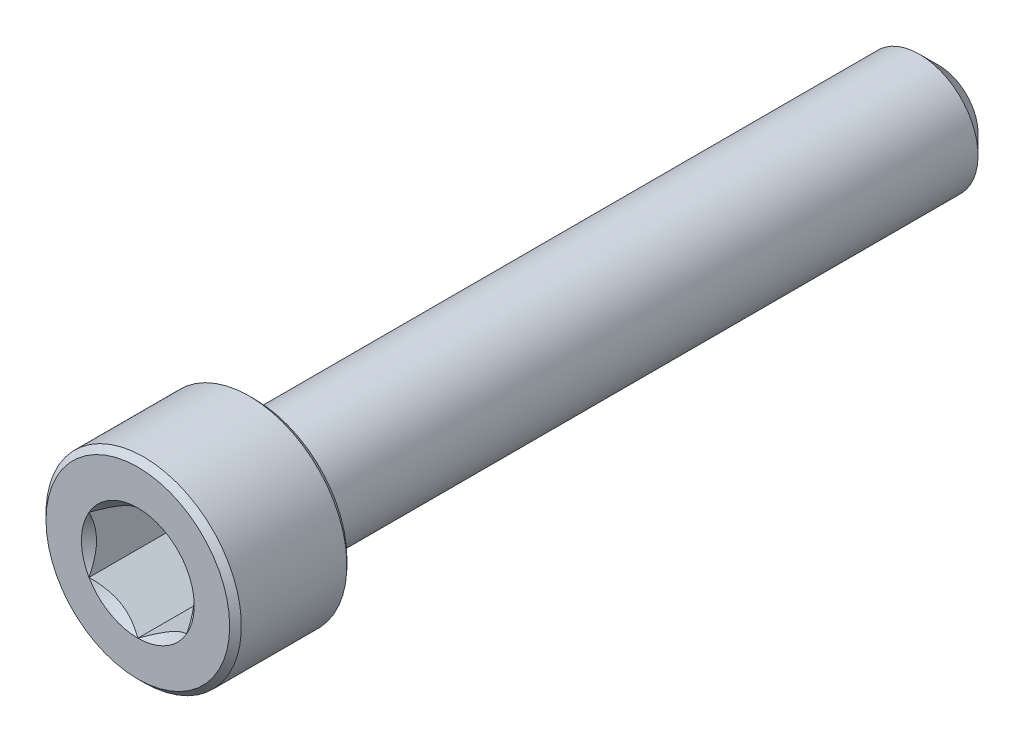
ISO-10303-21;
HEADER;
FILE_DESCRIPTION(('STEP AP214'),'2;1');
FILE_NAME('part.step','',(''),(''),'','','');
FILE_SCHEMA(('AUTOMOTIVE_DESIGN { 1 0 10303 214 1 1 1 1 }'));
ENDSEC;
DATA;
#1=APPLICATION_CONTEXT('core data for automotive mechanical design processes');
#2=APPLICATION_PROTOCOL_DEFINITION('international standard','automotive_design',2000,#1);
#3=PRODUCT_CONTEXT('',#1,'mechanical');
#4=PRODUCT('Part','Part','',(#3));
#5=PRODUCT_RELATED_PRODUCT_CATEGORY('part','',(#4));
#6=PRODUCT_DEFINITION_FORMATION('','',#4);
#7=PRODUCT_DEFINITION_CONTEXT('part definition',#1,'design');
#8=PRODUCT_DEFINITION('design','',#6,#7);
#9=PRODUCT_DEFINITION_SHAPE('','',#8);
#10=(LENGTH_UNIT() NAMED_UNIT(*) SI_UNIT(.MILLI.,.METRE.));
#11=(NAMED_UNIT(*) PLANE_ANGLE_UNIT() SI_UNIT($,.RADIAN.));
#12=(NAMED_UNIT(*) SI_UNIT($,.STERADIAN.) SOLID_ANGLE_UNIT());
#13=UNCERTAINTY_MEASURE_WITH_UNIT(LENGTH_MEASURE(1.E-05),#10,'distance_accuracy_value','');
#14=(GEOMETRIC_REPRESENTATION_CONTEXT(3) GLOBAL_UNCERTAINTY_ASSIGNED_CONTEXT((#13)) GLOBAL_UNIT_ASSIGNED_CONTEXT((#10,
#11,#12)) REPRESENTATION_CONTEXT('',''));
#15=CARTESIAN_POINT('',(0.,0.,0.));
#16=DIRECTION('',(0.,0.,1.));
#17=DIRECTION('',(1.,0.,0.));
#18=AXIS2_PLACEMENT_3D('',#15,#16,#17);
#19=CARTESIAN_POINT('',(0.,0.,20.5));
#20=DIRECTION('',(0.,0.,1.));
#21=DIRECTION('',(0.,-1.,0.));
#22=AXIS2_PLACEMENT_3D('',#19,#20,#21);
#23=PLANE('',#22);
#24=CARTESIAN_POINT('',(0.,0.,20.5));
#25=DIRECTION('',(0.,0.,1.));
#26=DIRECTION('',(1.,0.,0.));
#27=AXIS2_PLACEMENT_3D('',#24,#25,#26);
#28=CIRCLE('',#27,2.88675134594813);
#29=CARTESIAN_POINT('',(0.,-2.88675134594813,20.5));
#30=VERTEX_POINT('',#29);
#31=CARTESIAN_POINT('',(2.5,-1.44337567297406,20.5));
#32=VERTEX_POINT('',#31);
#33=EDGE_CURVE('E98',#30,#32,#28,.T.);
#34=ORIENTED_EDGE('',*,*,#33,.F.);
#35=CARTESIAN_POINT('',(-2.5,-1.44337567297406,20.5));
#36=VERTEX_POINT('',#35);
#37=EDGE_CURVE('E268',#36,#30,#28,.T.);
#38=ORIENTED_EDGE('',*,*,#37,.F.);
#39=CARTESIAN_POINT('',(-2.5,1.44337567297406,20.5));
#40=VERTEX_POINT('',#39);
#41=EDGE_CURVE('E133',#40,#36,#28,.T.);
#42=ORIENTED_EDGE('',*,*,#41,.F.);
#43=CARTESIAN_POINT('',(0.,2.88675134594813,20.5));
#44=VERTEX_POINT('',#43);
#45=EDGE_CURVE('E129',#44,#40,#28,.T.);
#46=ORIENTED_EDGE('',*,*,#45,.F.);
#47=CARTESIAN_POINT('',(2.5,1.44337567297407,20.5));
#48=VERTEX_POINT('',#47);
#49=EDGE_CURVE('E100',#48,#44,#28,.T.);
#50=ORIENTED_EDGE('',*,*,#49,.F.);
#51=EDGE_CURVE('E92',#32,#48,#28,.T.);
#52=ORIENTED_EDGE('',*,*,#51,.F.);
#53=EDGE_LOOP('',(#34,#38,#42,#46,#50,#52));
#54=FACE_BOUND('',#53,.T.);
#55=CARTESIAN_POINT('',(0.,0.,20.5));
#56=DIRECTION('',(0.,0.,-1.));
#57=DIRECTION('',(0.,1.,0.));
#58=AXIS2_PLACEMENT_3D('',#55,#56,#57);
#59=CIRCLE('',#58,4.7);
#60=CARTESIAN_POINT('',(0.,4.7,20.5));
#61=VERTEX_POINT('',#60);
#62=EDGE_CURVE('E48',#61,#61,#59,.T.);
#63=ORIENTED_EDGE('',*,*,#62,.F.);
#64=EDGE_LOOP('',(#63));
#65=FACE_BOUND('',#64,.T.);
#66=ADVANCED_FACE('F35',(#54,#65),#23,.T.);
#67=CARTESIAN_POINT('',(0.,0.,20.2));
#68=DIRECTION('',(0.,0.,-1.));
#69=DIRECTION('',(0.,1.,0.));
#70=AXIS2_PLACEMENT_3D('',#67,#68,#69);
#71=CONICAL_SURFACE('',#70,5.,0.785398163397457);
#72=ORIENTED_EDGE('',*,*,#62,.T.);
#73=EDGE_LOOP('',(#72));
#74=FACE_BOUND('',#73,.T.);
#75=CARTESIAN_POINT('',(0.,0.,20.2));
#76=DIRECTION('',(0.,0.,-1.));
#77=DIRECTION('',(0.,1.,0.));
#78=AXIS2_PLACEMENT_3D('',#75,#76,#77);
#79=CIRCLE('',#78,5.);
#80=CARTESIAN_POINT('',(0.,5.,20.2));
#81=VERTEX_POINT('',#80);
#82=EDGE_CURVE('E219',#81,#81,#79,.T.);
#83=ORIENTED_EDGE('',*,*,#82,.F.);
#84=EDGE_LOOP('',(#83));
#85=FACE_BOUND('',#84,.T.);
#86=ADVANCED_FACE('F207',(#74,#85),#71,.T.);
#87=CARTESIAN_POINT('',(0.,0.,-20.5));
#88=DIRECTION('',(0.,0.,-1.));
#89=DIRECTION('',(0.,1.,0.));
#90=AXIS2_PLACEMENT_3D('',#87,#88,#89);
#91=CYLINDRICAL_SURFACE('',#90,5.);
#92=ORIENTED_EDGE('',*,*,#82,.T.);
#93=EDGE_LOOP('',(#92));
#94=FACE_BOUND('',#93,.T.);
#95=CARTESIAN_POINT('',(0.,0.,14.8));
#96=DIRECTION('',(0.,0.,-1.));
#97=DIRECTION('',(0.,1.,0.));
#98=AXIS2_PLACEMENT_3D('',#95,#96,#97);
#99=CIRCLE('',#98,5.);
#100=CARTESIAN_POINT('',(0.,5.,14.8));
#101=VERTEX_POINT('',#100);
#102=EDGE_CURVE('E220',#101,#101,#99,.T.);
#103=ORIENTED_EDGE('',*,*,#102,.F.);
#104=EDGE_LOOP('',(#103));
#105=FACE_BOUND('',#104,.T.);
#106=ADVANCED_FACE('F204',(#94,#105),#91,.T.);
#107=CARTESIAN_POINT('',(0.,0.,14.5));
#108=DIRECTION('',(0.,0.,1.));
#109=DIRECTION('',(0.,-1.,0.));
#110=AXIS2_PLACEMENT_3D('',#107,#108,#109);
#111=CONICAL_SURFACE('',#110,4.7,0.785398163397445);
#112=ORIENTED_EDGE('',*,*,#102,.T.);
#113=EDGE_LOOP('',(#112));
#114=FACE_BOUND('',#113,.T.);
#115=CARTESIAN_POINT('',(0.,0.,14.5));
#116=DIRECTION('',(0.,0.,-1.));
#117=DIRECTION('',(0.,1.,0.));
#118=AXIS2_PLACEMENT_3D('',#115,#116,#117);
#119=CIRCLE('',#118,4.7);
#120=CARTESIAN_POINT('',(0.,4.7,14.5));
#121=VERTEX_POINT('',#120);
#122=EDGE_CURVE('E223',#121,#121,#119,.T.);
#123=ORIENTED_EDGE('',*,*,#122,.F.);
#124=EDGE_LOOP('',(#123));
#125=FACE_BOUND('',#124,.T.);
#126=ADVANCED_FACE('F200',(#114,#125),#111,.T.);
#127=CARTESIAN_POINT('',(0.,4.7,14.5));
#128=DIRECTION('',(0.,0.,-1.));
#129=DIRECTION('',(0.,1.,0.));
#130=AXIS2_PLACEMENT_3D('',#127,#128,#129);
#131=PLANE('',#130);
#132=ORIENTED_EDGE('',*,*,#122,.T.);
#133=EDGE_LOOP('',(#132));
#134=FACE_BOUND('',#133,.T.);
#135=CARTESIAN_POINT('',(0.,0.,14.5));
#136=DIRECTION('',(0.,0.,-1.));
#137=DIRECTION('',(0.,1.,0.));
#138=AXIS2_PLACEMENT_3D('',#135,#136,#137);
#139=CIRCLE('',#138,3.);
#140=CARTESIAN_POINT('',(0.,3.,14.5));
#141=VERTEX_POINT('',#140);
#142=EDGE_CURVE('E228',#141,#141,#139,.T.);
#143=ORIENTED_EDGE('',*,*,#142,.F.);
#144=EDGE_LOOP('',(#143));
#145=FACE_BOUND('',#144,.T.);
#146=ADVANCED_FACE('F196',(#134,#145),#131,.T.);
#147=CARTESIAN_POINT('',(0.,0.,-20.5));
#148=DIRECTION('',(0.,0.,-1.));
#149=DIRECTION('',(0.,1.,0.));
#150=AXIS2_PLACEMENT_3D('',#147,#148,#149);
#151=CYLINDRICAL_SURFACE('',#150,3.);
#152=ORIENTED_EDGE('',*,*,#142,.T.);
#153=EDGE_LOOP('',(#152));
#154=FACE_BOUND('',#153,.T.);
#155=CARTESIAN_POINT('',(0.,0.,-19.5));
#156=DIRECTION('',(0.,0.,-1.));
#157=DIRECTION('',(0.,1.,0.));
#158=AXIS2_PLACEMENT_3D('',#155,#156,#157);
#159=CIRCLE('',#158,3.);
#160=CARTESIAN_POINT('',(0.,3.,-19.5));
#161=VERTEX_POINT('',#160);
#162=EDGE_CURVE('E231',#161,#161,#159,.T.);
#163=ORIENTED_EDGE('',*,*,#162,.F.);
#164=EDGE_LOOP('',(#163));
#165=FACE_BOUND('',#164,.T.);
#166=ADVANCED_FACE('F192',(#154,#165),#151,.T.);
#167=CARTESIAN_POINT('',(0.,0.,-20.5));
#168=DIRECTION('',(0.,0.,1.));
#169=DIRECTION('',(0.,-1.,0.));
#170=AXIS2_PLACEMENT_3D('',#167,#168,#169);
#171=CONICAL_SURFACE('',#170,2.,0.785398163397441);
#172=ORIENTED_EDGE('',*,*,#162,.T.);
#173=EDGE_LOOP('',(#172));
#174=FACE_BOUND('',#173,.T.);
#175=CARTESIAN_POINT('',(0.,0.,-20.5));
#176=DIRECTION('',(0.,0.,-1.));
#177=DIRECTION('',(0.,1.,0.));
#178=AXIS2_PLACEMENT_3D('',#175,#176,#177);
#179=CIRCLE('',#178,2.);
#180=CARTESIAN_POINT('',(0.,2.,-20.5));
#181=VERTEX_POINT('',#180);
#182=EDGE_CURVE('E234',#181,#181,#179,.T.);
#183=ORIENTED_EDGE('',*,*,#182,.F.);
#184=EDGE_LOOP('',(#183));
#185=FACE_BOUND('',#184,.T.);
#186=ADVANCED_FACE('F188',(#174,#185),#171,.T.);
#187=CARTESIAN_POINT('',(0.,2.,-20.5));
#188=DIRECTION('',(0.,0.,-1.));
#189=DIRECTION('',(0.,1.,0.));
#190=AXIS2_PLACEMENT_3D('',#187,#188,#189);
#191=PLANE('',#190);
#192=ORIENTED_EDGE('',*,*,#182,.T.);
#193=EDGE_LOOP('',(#192));
#194=FACE_BOUND('',#193,.T.);
#195=ADVANCED_FACE('F185',(#194),#191,.T.);
#196=CARTESIAN_POINT('',(0.,0.,20.5));
#197=DIRECTION('',(0.,0.,1.));
#198=DIRECTION('',(1.,0.,0.));
#199=AXIS2_PLACEMENT_3D('',#196,#197,#198);
#200=CONICAL_SURFACE('',#199,2.88675134594813,0.78539816339745);
#201=ORIENTED_EDGE('',*,*,#33,.T.);
#202=CARTESIAN_POINT('',(-0.000199999999999538,-2.88686681600197,20.5001154769818));
#203=CARTESIAN_POINT('',(0.0857382777877649,-2.83725032818751,20.4505407053547));
#204=CARTESIAN_POINT('',(0.173113567275754,-2.7868041812811,20.4038774813625));
#205=CARTESIAN_POINT('',(0.351281456165589,-2.6839389026696,20.3184381400383));
#206=CARTESIAN_POINT('',(0.442091000681076,-2.6315099876986,20.279709562406));
#207=CARTESIAN_POINT('',(0.625204123126922,-2.52578957716234,20.2133667038977));
#208=CARTESIAN_POINT('',(0.717461064529342,-2.47252500720904,20.1855856685309));
#209=CARTESIAN_POINT('',(0.904006008776287,-2.3648232334321,20.1427831759107));
#210=CARTESIAN_POINT('',(0.998288312566284,-2.31038931995913,20.1277297666713));
#211=CARTESIAN_POINT('',(1.16077825829185,-2.21657570605387,20.1141477222095));
#212=CARTESIAN_POINT('',(1.22877596788015,-2.17731721011878,20.1121370992408));
#213=CARTESIAN_POINT('',(1.36466024116922,-2.0988643883567,20.1155241171875));
#214=CARTESIAN_POINT('',(1.43254675755224,-2.05967008984862,20.1209243552998));
#215=CARTESIAN_POINT('',(1.56767878823611,-1.98165157555715,20.1388257884025));
#216=CARTESIAN_POINT('',(1.63492349975356,-1.94282782326097,20.1513349270465));
#217=CARTESIAN_POINT('',(1.7682501008182,-1.86585167424616,20.1827675019557));
#218=CARTESIAN_POINT('',(1.83433207909966,-1.82769922629678,20.2016904464968));
#219=CARTESIAN_POINT('',(2.00359634669127,-1.72997445583858,20.2578673614082));
#220=CARTESIAN_POINT('',(2.10572912222289,-1.67100807039231,20.2993558315962));
#221=CARTESIAN_POINT('',(2.25590641494051,-1.58430317001562,20.3693940467231));
#222=CARTESIAN_POINT('',(2.30539653988261,-1.55573003305807,20.3940022521161));
#223=CARTESIAN_POINT('',(2.40346006383884,-1.49911303110426,20.4454618867152));
#224=CARTESIAN_POINT('',(2.45203400349693,-1.47106885396706,20.4723119387794));
#225=CARTESIAN_POINT('',(2.5002,-1.44326020292023,20.5001154769818));
#226=B_SPLINE_CURVE_WITH_KNOTS('',3,(#202,#203,#204,#205,#206,#207,#208,#209,#210,#211,#212,
#213,#214,#215,#216,#217,#218,#219,#220,#221,#222,#223,#224,#225),.UNSPECIFIED.,.F.,.F.,(4,2,2,
2,2,2,2,2,2,2,2,4),(0.,0.333012085133925,0.667964518301399,0.997597032043301,1.32639954393844,
1.56169424147169,1.79707142102083,2.03271213522171,2.26833478775651,2.64260240809533,
2.82922877818864,3.01574133749025),.UNSPECIFIED.);
#227=EDGE_CURVE('E12',#30,#32,#226,.T.);
#228=ORIENTED_EDGE('',*,*,#227,.F.);
#229=EDGE_LOOP('',(#201,#228));
#230=FACE_BOUND('',#229,.T.);
#231=ADVANCED_FACE('F151',(#230),#200,.F.);
#232=ORIENTED_EDGE('',*,*,#37,.T.);
#233=CARTESIAN_POINT('',(-2.5002,-1.44326020292023,20.5001154769818));
#234=CARTESIAN_POINT('',(-2.41426172221224,-1.49287669073468,20.4505407053547));
#235=CARTESIAN_POINT('',(-2.32688643272425,-1.5433228376411,20.4038774813625));
#236=CARTESIAN_POINT('',(-2.14871854383441,-1.64618811625259,20.3184381400383));
#237=CARTESIAN_POINT('',(-2.05790899931893,-1.69861703122359,20.279709562406));
#238=CARTESIAN_POINT('',(-1.87479587687308,-1.80433744175986,20.2133667038977));
#239=CARTESIAN_POINT('',(-1.78253893547066,-1.85760201171316,20.1855856685309));
#240=CARTESIAN_POINT('',(-1.59599399122371,-1.96530378549009,20.1427831759107));
#241=CARTESIAN_POINT('',(-1.50171168743372,-2.01973769896307,20.1277297666713));
#242=CARTESIAN_POINT('',(-1.33922174170815,-2.11355131286833,20.1141477222095));
#243=CARTESIAN_POINT('',(-1.27122403211985,-2.15280980880341,20.1121370992408));
#244=CARTESIAN_POINT('',(-1.13533975883078,-2.23126263056549,20.1155241171875));
#245=CARTESIAN_POINT('',(-1.06745324244776,-2.27045692907358,20.1209243552998));
#246=CARTESIAN_POINT('',(-0.932321211763893,-2.34847544336505,20.1388257884025));
#247=CARTESIAN_POINT('',(-0.865076500246439,-2.38729919566123,20.1513349270465));
#248=CARTESIAN_POINT('',(-0.7317498991818,-2.46427534467604,20.1827675019557));
#249=CARTESIAN_POINT('',(-0.665667920900341,-2.50242779262542,20.2016904464968));
#250=CARTESIAN_POINT('',(-0.496403653308734,-2.60015256308362,20.2578673614082));
#251=CARTESIAN_POINT('',(-0.394270877777106,-2.65911894852989,20.2993558315962));
#252=CARTESIAN_POINT('',(-0.244093585059489,-2.74582384890657,20.3693940467231));
#253=CARTESIAN_POINT('',(-0.194603460117389,-2.77439698586412,20.3940022521161));
#254=CARTESIAN_POINT('',(-0.0965399361611513,-2.83101398781794,20.4454618867152));
#255=CARTESIAN_POINT('',(-0.04796599650307,-2.85905816495513,20.4723119387794));
#256=CARTESIAN_POINT('',(0.000200000000001669,-2.88686681600197,20.5001154769818));
#257=B_SPLINE_CURVE_WITH_KNOTS('',3,(#233,#234,#235,#236,#237,#238,#239,#240,#241,#242,#243,
#244,#245,#246,#247,#248,#249,#250,#251,#252,#253,#254,#255,#256),.UNSPECIFIED.,.F.,.F.,(4,2,2,
2,2,2,2,2,2,2,2,4),(0.,0.333012085133925,0.667964518301399,0.997597032043301,1.32639954393845,
1.56169424147169,1.79707142102083,2.03271213522171,2.26833478775651,2.64260240809533,
2.82922877818864,3.01574133749025),.UNSPECIFIED.);
#258=EDGE_CURVE('E130',#36,#30,#257,.T.);
#259=ORIENTED_EDGE('',*,*,#258,.F.);
#260=EDGE_LOOP('',(#232,#259));
#261=FACE_BOUND('',#260,.T.);
#262=ADVANCED_FACE('F266',(#261),#200,.F.);
#263=ORIENTED_EDGE('',*,*,#41,.T.);
#264=CARTESIAN_POINT('',(-2.5,-2.87868021616154,21.4259641937847));
#265=CARTESIAN_POINT('',(-2.5,-2.80858751756355,21.3730547693995));
#266=CARTESIAN_POINT('',(-2.5,-2.73810237384457,21.3206567848064));
#267=CARTESIAN_POINT('',(-2.5,-2.59619238907469,21.2171126835152));
#268=CARTESIAN_POINT('',(-2.5,-2.52476731657143,21.1659668843779));
#269=CARTESIAN_POINT('',(-2.5,-2.38030019419698,21.0647924979814));
#270=CARTESIAN_POINT('',(-2.5,-2.307249903594,21.0147756377845));
#271=CARTESIAN_POINT('',(-2.5,-2.15990937397294,20.9166088439155));
#272=CARTESIAN_POINT('',(-2.5,-2.08561922308943,20.8684587783455));
#273=CARTESIAN_POINT('',(-2.5,-1.93130274871408,20.771746559452));
#274=CARTESIAN_POINT('',(-2.5,-1.8511916849785,20.7233189325373));
#275=CARTESIAN_POINT('',(-2.5,-1.68912282627168,20.6296640597041));
#276=CARTESIAN_POINT('',(-2.5,-1.60716527674864,20.5844363916948));
#277=CARTESIAN_POINT('',(-2.5,-1.44137668632319,20.4981353746693));
#278=CARTESIAN_POINT('',(-2.5,-1.35755175925796,20.4570503726636));
#279=CARTESIAN_POINT('',(-2.5,-1.1876157775942,20.3799618661066));
#280=CARTESIAN_POINT('',(-2.5,-1.10150577924729,20.3439560607346));
#281=CARTESIAN_POINT('',(-2.5,-0.933895283730373,20.2809497442851));
#282=CARTESIAN_POINT('',(-2.5,-0.852581486652411,20.2534577201431));
#283=CARTESIAN_POINT('',(-2.5,-0.687996185051424,20.2049971144174));
#284=CARTESIAN_POINT('',(-2.5,-0.604724546085162,20.184028982239));
#285=CARTESIAN_POINT('',(-2.5,-0.438105786501649,20.150059995013));
#286=CARTESIAN_POINT('',(-2.5,-0.354786957377881,20.1369226334436));
#287=CARTESIAN_POINT('',(-2.5,-0.187258638268771,20.1188701943996));
#288=CARTESIAN_POINT('',(-2.5,-0.103049303891732,20.1139537035302));
#289=CARTESIAN_POINT('',(-2.5,0.06238194585555,20.1127080743719));
#290=CARTESIAN_POINT('',(-2.5,0.143601667742495,20.1160745517109));
#291=CARTESIAN_POINT('',(-2.5,0.305344840533965,20.1305375923809));
#292=CARTESIAN_POINT('',(-2.5,0.385868223029658,20.1416349066531));
#293=CARTESIAN_POINT('',(-2.5,0.546999992477731,20.1711420785853));
#294=CARTESIAN_POINT('',(-2.5,0.627585258156381,20.1896763768309));
#295=CARTESIAN_POINT('',(-2.5,0.786991930978588,20.2330723320141));
#296=CARTESIAN_POINT('',(-2.5,0.865813485110825,20.2579334595174));
#297=CARTESIAN_POINT('',(-2.5,1.11399280220491,20.3455589112399));
#298=CARTESIAN_POINT('',(-2.5,1.27984027529456,20.4183033354746));
#299=CARTESIAN_POINT('',(-2.5,1.52253018655038,20.5395423452678));
#300=CARTESIAN_POINT('',(-2.5,1.60256472908879,20.5820714512072));
#301=CARTESIAN_POINT('',(-2.5,1.76081489282124,20.6703965241522));
#302=CARTESIAN_POINT('',(-2.5,1.83903083842886,20.7161919024767));
#303=CARTESIAN_POINT('',(-2.5,1.99000684607168,20.8080446787286));
#304=CARTESIAN_POINT('',(-2.5,2.06284472030444,20.8539756354245));
#305=CARTESIAN_POINT('',(-2.5,2.20727164736135,20.9477702453865));
#306=CARTESIAN_POINT('',(-2.5,2.27886060500402,20.9956340450436));
#307=CARTESIAN_POINT('',(-2.5,2.42037078548403,21.0925522363183));
#308=CARTESIAN_POINT('',(-2.5,2.49030083172878,21.1415937983162));
#309=CARTESIAN_POINT('',(-2.5,2.62920524991558,21.2409738351898));
#310=CARTESIAN_POINT('',(-2.5,2.69817987937839,21.2913119497074));
#311=CARTESIAN_POINT('',(-2.5,2.76675463365823,21.3421802976824));
#312=B_SPLINE_CURVE_WITH_KNOTS('',3,(#264,#265,#266,#267,#268,#269,#270,#271,#272,#273,#274,
#275,#276,#277,#278,#279,#280,#281,#282,#283,#284,#285,#286,#287,#288,#289,#290,#291,#292,#293,
#294,#295,#296,#297,#298,#299,#300,#301,#302,#303,#304,#305,#306,#307,#308,#309,#310,#311),
.UNSPECIFIED.,.F.,.F.,(4,2,2,2,2,2,2,2,2,2,2,2,2,2,2,2,2,2,2,2,2,2,2,4),(0.,0.263465914971114,
0.526997968323236,0.792571943279358,1.05812711983771,1.33890112548018,1.61963802629079,
1.89956181222216,2.17935838571897,2.436638876826,2.69393708705248,2.94660788173135,
3.19923523085016,3.44271854486786,3.68622551313359,3.93398926860573,4.18173229781968,
4.72334004841907,4.99521600382014,5.26704308216966,5.52534341671993,5.78366335141086,
6.03988492204047,6.29603603207541),.UNSPECIFIED.);
#313=EDGE_CURVE('E131',#40,#36,#312,.F.);
#314=ORIENTED_EDGE('',*,*,#313,.F.);
#315=EDGE_LOOP('',(#263,#314));
#316=FACE_BOUND('',#315,.T.);
#317=ADVANCED_FACE('F271',(#316),#200,.F.);
#318=ORIENTED_EDGE('',*,*,#45,.T.);
#319=CARTESIAN_POINT('',(0.000199999999998395,2.88686681600197,20.5001154769818));
#320=CARTESIAN_POINT('',(-0.0857382777877662,2.83725032818751,20.4505407053547));
#321=CARTESIAN_POINT('',(-0.173113567275754,2.7868041812811,20.4038774813625));
#322=CARTESIAN_POINT('',(-0.35128145616559,2.6839389026696,20.3184381400383));
#323=CARTESIAN_POINT('',(-0.442091000681076,2.6315099876986,20.279709562406));
#324=CARTESIAN_POINT('',(-0.625204123126922,2.52578957716234,20.2133667038977));
#325=CARTESIAN_POINT('',(-0.717461064529342,2.47252500720904,20.1855856685309));
#326=CARTESIAN_POINT('',(-0.904006008776287,2.3648232334321,20.1427831759107));
#327=CARTESIAN_POINT('',(-0.998288312566284,2.31038931995913,20.1277297666713));
#328=CARTESIAN_POINT('',(-1.16077825829185,2.21657570605387,20.1141477222095));
#329=CARTESIAN_POINT('',(-1.22877596788015,2.17731721011878,20.1121370992408));
#330=CARTESIAN_POINT('',(-1.36466024116922,2.0988643883567,20.1155241171875));
#331=CARTESIAN_POINT('',(-1.43254675755224,2.05967008984862,20.1209243552998));
#332=CARTESIAN_POINT('',(-1.56767878823611,1.98165157555715,20.1388257884025));
#333=CARTESIAN_POINT('',(-1.63492349975356,1.94282782326097,20.1513349270465));
#334=CARTESIAN_POINT('',(-1.7682501008182,1.86585167424616,20.1827675019557));
#335=CARTESIAN_POINT('',(-1.83433207909966,1.82769922629678,20.2016904464968));
#336=CARTESIAN_POINT('',(-2.00359634669126,1.72997445583858,20.2578673614082));
#337=CARTESIAN_POINT('',(-2.10572912222289,1.67100807039231,20.2993558315962));
#338=CARTESIAN_POINT('',(-2.25590641494051,1.58430317001562,20.3693940467231));
#339=CARTESIAN_POINT('',(-2.30539653988261,1.55573003305807,20.3940022521161));
#340=CARTESIAN_POINT('',(-2.40346006383885,1.49911303110426,20.4454618867152));
#341=CARTESIAN_POINT('',(-2.45203400349693,1.47106885396706,20.4723119387794));
#342=CARTESIAN_POINT('',(-2.5002,1.44326020292023,20.5001154769818));
#343=B_SPLINE_CURVE_WITH_KNOTS('',3,(#319,#320,#321,#322,#323,#324,#325,#326,#327,#328,#329,
#330,#331,#332,#333,#334,#335,#336,#337,#338,#339,#340,#341,#342),.UNSPECIFIED.,.F.,.F.,(4,2,2,
2,2,2,2,2,2,2,2,4),(0.,0.333012085133923,0.667964518301396,0.997597032043298,1.32639954393844,
1.56169424147168,1.79707142102083,2.03271213522171,2.2683347877565,2.64260240809533,
2.82922877818863,3.01574133749024),.UNSPECIFIED.);
#344=EDGE_CURVE('E110',#44,#40,#343,.T.);
#345=ORIENTED_EDGE('',*,*,#344,.F.);
#346=EDGE_LOOP('',(#318,#345));
#347=FACE_BOUND('',#346,.T.);
#348=ADVANCED_FACE('F305',(#347),#200,.F.);
#349=ORIENTED_EDGE('',*,*,#49,.T.);
#350=CARTESIAN_POINT('',(2.5002,1.44326020292023,20.5001154769818));
#351=CARTESIAN_POINT('',(2.41426172221224,1.49287669073468,20.4505407053547));
#352=CARTESIAN_POINT('',(2.32688643272425,1.5433228376411,20.4038774813625));
#353=CARTESIAN_POINT('',(2.14871854383441,1.64618811625259,20.3184381400383));
#354=CARTESIAN_POINT('',(2.05790899931893,1.69861703122359,20.279709562406));
#355=CARTESIAN_POINT('',(1.87479587687308,1.80433744175986,20.2133667038977));
#356=CARTESIAN_POINT('',(1.78253893547066,1.85760201171315,20.1855856685309));
#357=CARTESIAN_POINT('',(1.59599399122371,1.96530378549009,20.1427831759107));
#358=CARTESIAN_POINT('',(1.50171168743372,2.01973769896307,20.1277297666713));
#359=CARTESIAN_POINT('',(1.33922174170815,2.11355131286833,20.1141477222095));
#360=CARTESIAN_POINT('',(1.27122403211985,2.15280980880341,20.1121370992408));
#361=CARTESIAN_POINT('',(1.13533975883078,2.23126263056549,20.1155241171875));
#362=CARTESIAN_POINT('',(1.06745324244776,2.27045692907357,20.1209243552998));
#363=CARTESIAN_POINT('',(0.932321211763893,2.34847544336505,20.1388257884025));
#364=CARTESIAN_POINT('',(0.865076500246439,2.38729919566123,20.1513349270465));
#365=CARTESIAN_POINT('',(0.7317498991818,2.46427534467603,20.1827675019557));
#366=CARTESIAN_POINT('',(0.665667920900342,2.50242779262542,20.2016904464968));
#367=CARTESIAN_POINT('',(0.496403653308735,2.60015256308362,20.2578673614082));
#368=CARTESIAN_POINT('',(0.394270877777107,2.65911894852989,20.2993558315962));
#369=CARTESIAN_POINT('',(0.244093585059492,2.74582384890657,20.3693940467231));
#370=CARTESIAN_POINT('',(0.194603460117392,2.77439698586412,20.3940022521161));
#371=CARTESIAN_POINT('',(0.0965399361611543,2.83101398781794,20.4454618867152));
#372=CARTESIAN_POINT('',(0.047965996503073,2.85905816495513,20.4723119387794));
#373=CARTESIAN_POINT('',(-0.0002000000000001,2.88686681600197,20.5001154769818));
#374=B_SPLINE_CURVE_WITH_KNOTS('',3,(#350,#351,#352,#353,#354,#355,#356,#357,#358,#359,#360,
#361,#362,#363,#364,#365,#366,#367,#368,#369,#370,#371,#372,#373),.UNSPECIFIED.,.F.,.F.,(4,2,2,
2,2,2,2,2,2,2,2,4),(0.,0.333012085133925,0.667964518301398,0.997597032043301,1.32639954393844,
1.56169424147169,1.79707142102083,2.03271213522171,2.26833478775651,2.64260240809533,
2.82922877818864,3.01574133749025),.UNSPECIFIED.);
#375=EDGE_CURVE('E103',#48,#44,#374,.T.);
#376=ORIENTED_EDGE('',*,*,#375,.F.);
#377=EDGE_LOOP('',(#349,#376));
#378=FACE_BOUND('',#377,.T.);
#379=ADVANCED_FACE('F104',(#378),#200,.F.);
#380=ORIENTED_EDGE('',*,*,#51,.T.);
#381=CARTESIAN_POINT('',(2.5,-2.87868021616154,21.4259641937847));
#382=CARTESIAN_POINT('',(2.5,-2.80858751756355,21.3730547693995));
#383=CARTESIAN_POINT('',(2.5,-2.73810237384458,21.3206567848064));
#384=CARTESIAN_POINT('',(2.5,-2.59619238907469,21.2171126835152));
#385=CARTESIAN_POINT('',(2.5,-2.52476731657143,21.1659668843779));
#386=CARTESIAN_POINT('',(2.5,-2.38030019419698,21.0647924979814));
#387=CARTESIAN_POINT('',(2.5,-2.307249903594,21.0147756377845));
#388=CARTESIAN_POINT('',(2.5,-2.15990937397294,20.9166088439155));
#389=CARTESIAN_POINT('',(2.5,-2.08561922308943,20.8684587783455));
#390=CARTESIAN_POINT('',(2.5,-1.93130274871409,20.771746559452));
#391=CARTESIAN_POINT('',(2.5,-1.8511916849785,20.7233189325373));
#392=CARTESIAN_POINT('',(2.5,-1.68912282627168,20.6296640597041));
#393=CARTESIAN_POINT('',(2.5,-1.60716527674864,20.5844363916948));
#394=CARTESIAN_POINT('',(2.5,-1.44137668632319,20.4981353746693));
#395=CARTESIAN_POINT('',(2.5,-1.35755175925796,20.4570503726636));
#396=CARTESIAN_POINT('',(2.5,-1.1876157775942,20.3799618661066));
#397=CARTESIAN_POINT('',(2.5,-1.10150577924729,20.3439560607346));
#398=CARTESIAN_POINT('',(2.5,-0.933895283730373,20.2809497442851));
#399=CARTESIAN_POINT('',(2.5,-0.852581486652411,20.2534577201431));
#400=CARTESIAN_POINT('',(2.5,-0.687996185051425,20.2049971144174));
#401=CARTESIAN_POINT('',(2.5,-0.604724546085162,20.184028982239));
#402=CARTESIAN_POINT('',(2.5,-0.438105786501649,20.150059995013));
#403=CARTESIAN_POINT('',(2.5,-0.354786957377882,20.1369226334436));
#404=CARTESIAN_POINT('',(2.5,-0.187258638268773,20.1188701943996));
#405=CARTESIAN_POINT('',(2.5,-0.103049303891733,20.1139537035302));
#406=CARTESIAN_POINT('',(2.5,0.0623819458555487,20.1127080743719));
#407=CARTESIAN_POINT('',(2.5,0.143601667742494,20.1160745517109));
#408=CARTESIAN_POINT('',(2.5,0.305344840533964,20.1305375923809));
#409=CARTESIAN_POINT('',(2.5,0.385868223029657,20.1416349066531));
#410=CARTESIAN_POINT('',(2.5,0.546999992477729,20.1711420785853));
#411=CARTESIAN_POINT('',(2.5,0.627585258156378,20.1896763768309));
#412=CARTESIAN_POINT('',(2.5,0.786991930978586,20.2330723320141));
#413=CARTESIAN_POINT('',(2.5,0.865813485110823,20.2579334595174));
#414=CARTESIAN_POINT('',(2.5,1.11399280220491,20.3455589112399));
#415=CARTESIAN_POINT('',(2.5,1.27984027529456,20.4183033354746));
#416=CARTESIAN_POINT('',(2.5,1.52253018655038,20.5395423452678));
#417=CARTESIAN_POINT('',(2.5,1.60256472908879,20.5820714512072));
#418=CARTESIAN_POINT('',(2.5,1.76081489282124,20.6703965241522));
#419=CARTESIAN_POINT('',(2.5,1.83903083842886,20.7161919024767));
#420=CARTESIAN_POINT('',(2.5,1.99000684607167,20.8080446787286));
#421=CARTESIAN_POINT('',(2.5,2.06284472030444,20.8539756354245));
#422=CARTESIAN_POINT('',(2.5,2.20727164736135,20.9477702453865));
#423=CARTESIAN_POINT('',(2.5,2.27886060500402,20.9956340450436));
#424=CARTESIAN_POINT('',(2.5,2.42037078548403,21.0925522363183));
#425=CARTESIAN_POINT('',(2.5,2.49030083172878,21.1415937983162));
#426=CARTESIAN_POINT('',(2.5,2.62920524991558,21.2409738351898));
#427=CARTESIAN_POINT('',(2.5,2.69817987937839,21.2913119497074));
#428=CARTESIAN_POINT('',(2.5,2.76675463365823,21.3421802976824));
#429=B_SPLINE_CURVE_WITH_KNOTS('',3,(#381,#382,#383,#384,#385,#386,#387,#388,#389,#390,#391,
#392,#393,#394,#395,#396,#397,#398,#399,#400,#401,#402,#403,#404,#405,#406,#407,#408,#409,#410,
#411,#412,#413,#414,#415,#416,#417,#418,#419,#420,#421,#422,#423,#424,#425,#426,#427,#428),
.UNSPECIFIED.,.F.,.F.,(4,2,2,2,2,2,2,2,2,2,2,2,2,2,2,2,2,2,2,2,2,2,2,4),(0.,0.263465914971114,
0.526997968323237,0.792571943279359,1.05812711983771,1.33890112548018,1.61963802629079,
1.89956181222216,2.17935838571897,2.436638876826,2.69393708705248,2.94660788173135,
3.19923523085015,3.44271854486786,3.68622551313359,3.93398926860572,4.18173229781968,
4.72334004841907,4.99521600382014,5.26704308216966,5.52534341671992,5.78366335141085,
6.03988492204046,6.2960360320754),.UNSPECIFIED.);
#430=EDGE_CURVE('E54',#32,#48,#429,.T.);
#431=ORIENTED_EDGE('',*,*,#430,.F.);
#432=EDGE_LOOP('',(#380,#431));
#433=FACE_BOUND('',#432,.T.);
#434=ADVANCED_FACE('F94',(#433),#200,.F.);
#435=CARTESIAN_POINT('',(0.,4.7,15.5));
#436=DIRECTION('',(0.,0.,-1.));
#437=DIRECTION('',(0.,1.,0.));
#438=AXIS2_PLACEMENT_3D('',#435,#436,#437);
#439=PLANE('',#438);
#440=DIRECTION('',(0.866025403784439,0.5,0.));
#441=VECTOR('',#440,1.);
#442=CARTESIAN_POINT('',(0.,-2.88675134594813,15.5));
#443=LINE('',#442,#441);
#444=CARTESIAN_POINT('',(0.,-2.88675134594813,15.5));
#445=VERTEX_POINT('',#444);
#446=CARTESIAN_POINT('',(2.5,-1.44337567297406,15.5));
#447=VERTEX_POINT('',#446);
#448=EDGE_CURVE('E237',#445,#447,#443,.T.);
#449=ORIENTED_EDGE('',*,*,#448,.T.);
#450=DIRECTION('',(0.,1.,0.));
#451=VECTOR('',#450,1.);
#452=CARTESIAN_POINT('',(2.5,-1.44337567297406,15.5));
#453=LINE('',#452,#451);
#454=CARTESIAN_POINT('',(2.5,1.44337567297406,15.5));
#455=VERTEX_POINT('',#454);
#456=EDGE_CURVE('E120',#447,#455,#453,.T.);
#457=ORIENTED_EDGE('',*,*,#456,.T.);
#458=DIRECTION('',(-0.866025403784439,0.5,0.));
#459=VECTOR('',#458,1.);
#460=CARTESIAN_POINT('',(2.5,1.44337567297406,15.5));
#461=LINE('',#460,#459);
#462=CARTESIAN_POINT('',(0.,2.88675134594813,15.5));
#463=VERTEX_POINT('',#462);
#464=EDGE_CURVE('E124',#455,#463,#461,.T.);
#465=ORIENTED_EDGE('',*,*,#464,.T.);
#466=DIRECTION('',(-0.866025403784438,-0.5,0.));
#467=VECTOR('',#466,1.);
#468=CARTESIAN_POINT('',(0.,2.88675134594813,15.5));
#469=LINE('',#468,#467);
#470=CARTESIAN_POINT('',(-2.5,1.44337567297406,15.5));
#471=VERTEX_POINT('',#470);
#472=EDGE_CURVE('E241',#463,#471,#469,.T.);
#473=ORIENTED_EDGE('',*,*,#472,.T.);
#474=DIRECTION('',(0.,-1.,0.));
#475=VECTOR('',#474,1.);
#476=CARTESIAN_POINT('',(-2.5,1.44337567297406,15.5));
#477=LINE('',#476,#475);
#478=CARTESIAN_POINT('',(-2.5,-1.44337567297406,15.5));
#479=VERTEX_POINT('',#478);
#480=EDGE_CURVE('E245',#471,#479,#477,.T.);
#481=ORIENTED_EDGE('',*,*,#480,.T.);
#482=DIRECTION('',(0.866025403784439,-0.5,0.));
#483=VECTOR('',#482,1.);
#484=CARTESIAN_POINT('',(-2.5,-1.44337567297406,15.5));
#485=LINE('',#484,#483);
#486=EDGE_CURVE('E247',#479,#445,#485,.T.);
#487=ORIENTED_EDGE('',*,*,#486,.T.);
#488=EDGE_LOOP('',(#449,#457,#465,#473,#481,#487));
#489=FACE_BOUND('',#488,.T.);
#490=ADVANCED_FACE('F150',(#489),#439,.F.);
#491=CARTESIAN_POINT('',(0.,-2.88675134594813,6.86237384174027));
#492=DIRECTION('',(0.5,-0.866025403784438,0.));
#493=DIRECTION('',(0.866025403784439,0.5,0.));
#494=AXIS2_PLACEMENT_3D('',#491,#492,#493);
#495=PLANE('',#494);
#496=DIRECTION('',(0.,0.,1.));
#497=VECTOR('',#496,1.);
#498=CARTESIAN_POINT('',(0.,-2.88675134594813,6.86237384174027));
#499=LINE('',#498,#497);
#500=EDGE_CURVE('E248',#445,#30,#499,.T.);
#501=ORIENTED_EDGE('',*,*,#500,.T.);
#502=ORIENTED_EDGE('',*,*,#227,.T.);
#503=DIRECTION('',(0.,0.,1.));
#504=VECTOR('',#503,1.);
#505=CARTESIAN_POINT('',(2.5,-1.44337567297406,6.86237384174027));
#506=LINE('',#505,#504);
#507=EDGE_CURVE('E119',#447,#32,#506,.T.);
#508=ORIENTED_EDGE('',*,*,#507,.F.);
#509=ORIENTED_EDGE('',*,*,#448,.F.);
#510=EDGE_LOOP('',(#501,#502,#508,#509));
#511=FACE_BOUND('',#510,.T.);
#512=ADVANCED_FACE('F152',(#511),#495,.F.);
#513=CARTESIAN_POINT('',(-2.5,-1.44337567297406,6.86237384174027));
#514=DIRECTION('',(-0.5,-0.866025403784439,0.));
#515=DIRECTION('',(0.866025403784439,-0.5,0.));
#516=AXIS2_PLACEMENT_3D('',#513,#514,#515);
#517=PLANE('',#516);
#518=DIRECTION('',(0.,0.,1.));
#519=VECTOR('',#518,1.);
#520=CARTESIAN_POINT('',(-2.5,-1.44337567297406,6.86237384174027));
#521=LINE('',#520,#519);
#522=EDGE_CURVE('E62',#479,#36,#521,.T.);
#523=ORIENTED_EDGE('',*,*,#522,.T.);
#524=ORIENTED_EDGE('',*,*,#258,.T.);
#525=ORIENTED_EDGE('',*,*,#500,.F.);
#526=ORIENTED_EDGE('',*,*,#486,.F.);
#527=EDGE_LOOP('',(#523,#524,#525,#526));
#528=FACE_BOUND('',#527,.T.);
#529=ADVANCED_FACE('F146',(#528),#517,.F.);
#530=CARTESIAN_POINT('',(-2.5,1.44337567297406,6.86237384174027));
#531=DIRECTION('',(-1.,0.,0.));
#532=DIRECTION('',(0.,-1.,0.));
#533=AXIS2_PLACEMENT_3D('',#530,#531,#532);
#534=PLANE('',#533);
#535=DIRECTION('',(0.,0.,1.));
#536=VECTOR('',#535,1.);
#537=CARTESIAN_POINT('',(-2.5,1.44337567297406,6.86237384174027));
#538=LINE('',#537,#536);
#539=EDGE_CURVE('E242',#471,#40,#538,.T.);
#540=ORIENTED_EDGE('',*,*,#539,.T.);
#541=ORIENTED_EDGE('',*,*,#313,.T.);
#542=ORIENTED_EDGE('',*,*,#522,.F.);
#543=ORIENTED_EDGE('',*,*,#480,.F.);
#544=EDGE_LOOP('',(#540,#541,#542,#543));
#545=FACE_BOUND('',#544,.T.);
#546=ADVANCED_FACE('F277',(#545),#534,.F.);
#547=CARTESIAN_POINT('',(0.,2.88675134594813,6.86237384174027));
#548=DIRECTION('',(-0.5,0.866025403784438,0.));
#549=DIRECTION('',(-0.866025403784438,-0.5,0.));
#550=AXIS2_PLACEMENT_3D('',#547,#548,#549);
#551=PLANE('',#550);
#552=DIRECTION('',(0.,0.,1.));
#553=VECTOR('',#552,1.);
#554=CARTESIAN_POINT('',(0.,2.88675134594813,6.86237384174027));
#555=LINE('',#554,#553);
#556=EDGE_CURVE('E239',#463,#44,#555,.T.);
#557=ORIENTED_EDGE('',*,*,#556,.T.);
#558=ORIENTED_EDGE('',*,*,#344,.T.);
#559=ORIENTED_EDGE('',*,*,#539,.F.);
#560=ORIENTED_EDGE('',*,*,#472,.F.);
#561=EDGE_LOOP('',(#557,#558,#559,#560));
#562=FACE_BOUND('',#561,.T.);
#563=ADVANCED_FACE('F177',(#562),#551,.F.);
#564=CARTESIAN_POINT('',(2.5,1.44337567297406,6.86237384174027));
#565=DIRECTION('',(0.5,0.866025403784439,0.));
#566=DIRECTION('',(-0.866025403784439,0.5,0.));
#567=AXIS2_PLACEMENT_3D('',#564,#565,#566);
#568=PLANE('',#567);
#569=DIRECTION('',(0.,0.,1.));
#570=VECTOR('',#569,1.);
#571=CARTESIAN_POINT('',(2.5,1.44337567297406,6.86237384174027));
#572=LINE('',#571,#570);
#573=EDGE_CURVE('E116',#455,#48,#572,.T.);
#574=ORIENTED_EDGE('',*,*,#573,.T.);
#575=ORIENTED_EDGE('',*,*,#375,.T.);
#576=ORIENTED_EDGE('',*,*,#556,.F.);
#577=ORIENTED_EDGE('',*,*,#464,.F.);
#578=EDGE_LOOP('',(#574,#575,#576,#577));
#579=FACE_BOUND('',#578,.T.);
#580=ADVANCED_FACE('F122',(#579),#568,.F.);
#581=CARTESIAN_POINT('',(2.5,-1.44337567297406,6.86237384174027));
#582=DIRECTION('',(1.,0.,0.));
#583=DIRECTION('',(0.,0.,-1.));
#584=AXIS2_PLACEMENT_3D('',#581,#582,#583);
#585=PLANE('',#584);
#586=ORIENTED_EDGE('',*,*,#507,.T.);
#587=ORIENTED_EDGE('',*,*,#430,.T.);
#588=ORIENTED_EDGE('',*,*,#573,.F.);
#589=ORIENTED_EDGE('',*,*,#456,.F.);
#590=EDGE_LOOP('',(#586,#587,#588,#589));
#591=FACE_BOUND('',#590,.T.);
#592=ADVANCED_FACE('F115',(#591),#585,.F.);
#593=CLOSED_SHELL('',(#66,#86,#106,#126,#146,#166,#186,#195,#231,#262,#317,#348,#379,#434,#490,
#512,#529,#546,#563,#580,#592));
#594=MANIFOLD_SOLID_BREP('B2',#593);
#595=ADVANCED_BREP_SHAPE_REPRESENTATION('',(#18,#594),#14);
#596=SHAPE_DEFINITION_REPRESENTATION(#9,#595);
ENDSEC;
END-ISO-10303-21;
